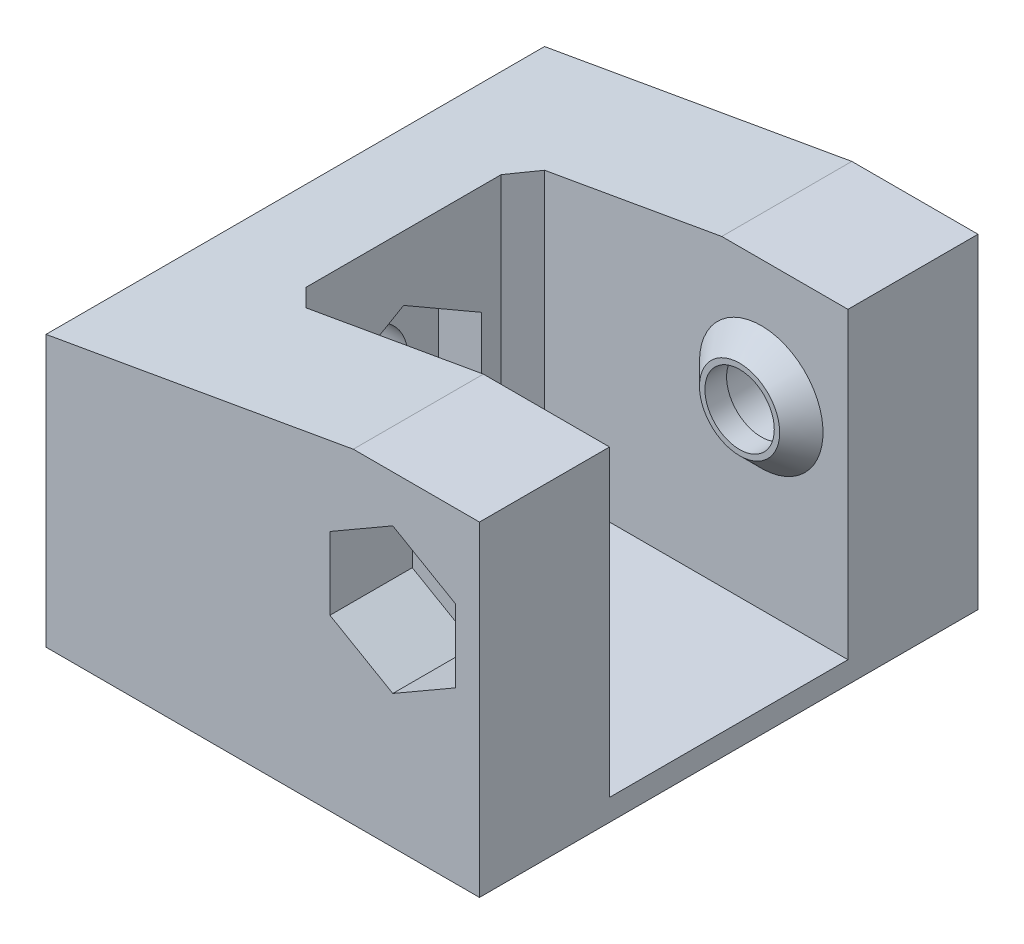
ISO-10303-21;
HEADER;
FILE_DESCRIPTION(('STEP AP214'),'2;1');
FILE_NAME('part.step','',(''),(''),'','','');
FILE_SCHEMA(('AUTOMOTIVE_DESIGN { 1 0 10303 214 1 1 1 1 }'));
ENDSEC;
DATA;
#1=APPLICATION_CONTEXT('core data for automotive mechanical design processes');
#2=APPLICATION_PROTOCOL_DEFINITION('international standard','automotive_design',2000,#1);
#3=PRODUCT_CONTEXT('',#1,'mechanical');
#4=PRODUCT('Part','Part','',(#3));
#5=PRODUCT_RELATED_PRODUCT_CATEGORY('part','',(#4));
#6=PRODUCT_DEFINITION_FORMATION('','',#4);
#7=PRODUCT_DEFINITION_CONTEXT('part definition',#1,'design');
#8=PRODUCT_DEFINITION('design','',#6,#7);
#9=PRODUCT_DEFINITION_SHAPE('','',#8);
#10=(LENGTH_UNIT() NAMED_UNIT(*) SI_UNIT(.MILLI.,.METRE.));
#11=(NAMED_UNIT(*) PLANE_ANGLE_UNIT() SI_UNIT($,.RADIAN.));
#12=(NAMED_UNIT(*) SI_UNIT($,.STERADIAN.) SOLID_ANGLE_UNIT());
#13=UNCERTAINTY_MEASURE_WITH_UNIT(LENGTH_MEASURE(1.E-05),#10,'distance_accuracy_value','');
#14=(GEOMETRIC_REPRESENTATION_CONTEXT(3) GLOBAL_UNCERTAINTY_ASSIGNED_CONTEXT((#13)) GLOBAL_UNIT_ASSIGNED_CONTEXT((#10,
#11,#12)) REPRESENTATION_CONTEXT('',''));
#15=CARTESIAN_POINT('',(0.,0.,0.));
#16=DIRECTION('',(0.,0.,1.));
#17=DIRECTION('',(1.,0.,0.));
#18=AXIS2_PLACEMENT_3D('',#15,#16,#17);
#19=CARTESIAN_POINT('',(16.,9.49999999999999,0.));
#20=DIRECTION('',(0.,0.,-1.));
#21=DIRECTION('',(0.,1.,0.));
#22=AXIS2_PLACEMENT_3D('',#19,#20,#21);
#23=CYLINDRICAL_SURFACE('',#22,1.7);
#24=CARTESIAN_POINT('',(16.,9.49999999999999,-6.));
#25=DIRECTION('',(0.,0.,1.));
#26=DIRECTION('',(0.,-1.,0.));
#27=AXIS2_PLACEMENT_3D('',#24,#25,#26);
#28=CIRCLE('',#27,1.7);
#29=CARTESIAN_POINT('',(16.,7.79999999999999,-6.));
#30=VERTEX_POINT('',#29);
#31=EDGE_CURVE('E226',#30,#30,#28,.T.);
#32=ORIENTED_EDGE('',*,*,#31,.F.);
#33=EDGE_LOOP('',(#32));
#34=FACE_BOUND('',#33,.T.);
#35=CARTESIAN_POINT('',(16.,9.49999999999999,-3.8));
#36=DIRECTION('',(0.,0.,1.));
#37=DIRECTION('',(1.,0.,0.));
#38=AXIS2_PLACEMENT_3D('',#35,#36,#37);
#39=CIRCLE('',#38,1.7);
#40=CARTESIAN_POINT('',(17.7,9.49999999999999,-3.8));
#41=VERTEX_POINT('',#40);
#42=EDGE_CURVE('E291',#41,#41,#39,.F.);
#43=ORIENTED_EDGE('',*,*,#42,.F.);
#44=EDGE_LOOP('',(#43));
#45=FACE_BOUND('',#44,.T.);
#46=ADVANCED_FACE('F37',(#34,#45),#23,.F.);
#47=CARTESIAN_POINT('',(16.,9.5,-17.));
#48=DIRECTION('',(0.,0.,-1.));
#49=DIRECTION('',(-1.,0.,0.));
#50=AXIS2_PLACEMENT_3D('',#47,#48,#49);
#51=CIRCLE('',#50,1.7);
#52=CARTESIAN_POINT('',(14.3,9.5,-17.));
#53=VERTEX_POINT('',#52);
#54=EDGE_CURVE('E221',#53,#53,#51,.T.);
#55=ORIENTED_EDGE('',*,*,#54,.F.);
#56=EDGE_LOOP('',(#55));
#57=FACE_BOUND('',#56,.T.);
#58=CARTESIAN_POINT('',(16.,9.5,-20.5));
#59=DIRECTION('',(0.,0.,-1.));
#60=DIRECTION('',(-1.,0.,0.));
#61=AXIS2_PLACEMENT_3D('',#58,#59,#60);
#62=CIRCLE('',#61,1.7);
#63=CARTESIAN_POINT('',(14.3,9.5,-20.5));
#64=VERTEX_POINT('',#63);
#65=EDGE_CURVE('E286',#64,#64,#62,.F.);
#66=ORIENTED_EDGE('',*,*,#65,.F.);
#67=EDGE_LOOP('',(#66));
#68=FACE_BOUND('',#67,.T.);
#69=ADVANCED_FACE('F456',(#57,#68),#23,.F.);
#70=CARTESIAN_POINT('',(10.,6.24999999999995,-11.5));
#71=DIRECTION('',(-1.,0.,0.));
#72=DIRECTION('',(0.,0.,1.));
#73=AXIS2_PLACEMENT_3D('',#70,#71,#72);
#74=CYLINDRICAL_SURFACE('',#73,2.2);
#75=CARTESIAN_POINT('',(0.,6.24999999999995,-11.5));
#76=DIRECTION('',(-1.,0.,0.));
#77=DIRECTION('',(0.,0.,1.));
#78=AXIS2_PLACEMENT_3D('',#75,#76,#77);
#79=CIRCLE('',#78,2.2);
#80=CARTESIAN_POINT('',(0.,6.24999999999995,-9.3));
#81=VERTEX_POINT('',#80);
#82=EDGE_CURVE('E262',#81,#81,#79,.T.);
#83=ORIENTED_EDGE('',*,*,#82,.T.);
#84=EDGE_LOOP('',(#83));
#85=FACE_BOUND('',#84,.T.);
#86=CARTESIAN_POINT('',(3.,6.24999999999995,-11.5));
#87=DIRECTION('',(1.,0.,0.));
#88=DIRECTION('',(0.,0.,-1.));
#89=AXIS2_PLACEMENT_3D('',#86,#87,#88);
#90=CIRCLE('',#89,2.2);
#91=CARTESIAN_POINT('',(3.,6.24999999999995,-13.7));
#92=VERTEX_POINT('',#91);
#93=EDGE_CURVE('E282',#92,#92,#90,.F.);
#94=ORIENTED_EDGE('',*,*,#93,.F.);
#95=EDGE_LOOP('',(#94));
#96=FACE_BOUND('',#95,.T.);
#97=ADVANCED_FACE('F437',(#85,#96),#74,.F.);
#98=CARTESIAN_POINT('',(20.,15.,0.));
#99=DIRECTION('',(0.,-1.,0.));
#100=DIRECTION('',(0.,0.,-1.));
#101=AXIS2_PLACEMENT_3D('',#98,#99,#100);
#102=PLANE('',#101);
#103=DIRECTION('',(-1.,0.,0.));
#104=VECTOR('',#103,1.);
#105=CARTESIAN_POINT('',(20.,15.,-23.));
#106=LINE('',#105,#104);
#107=CARTESIAN_POINT('',(20.,15.,-23.));
#108=VERTEX_POINT('',#107);
#109=CARTESIAN_POINT('',(14.1782045490451,15.,-23.));
#110=VERTEX_POINT('',#109);
#111=EDGE_CURVE('E250',#108,#110,#106,.T.);
#112=ORIENTED_EDGE('',*,*,#111,.T.);
#113=DIRECTION('',(0.,0.,1.));
#114=VECTOR('',#113,1.);
#115=CARTESIAN_POINT('',(14.1782045490451,15.,0.));
#116=LINE('',#115,#114);
#117=CARTESIAN_POINT('',(14.1782045490451,15.,-17.));
#118=VERTEX_POINT('',#117);
#119=EDGE_CURVE('E264',#110,#118,#116,.T.);
#120=ORIENTED_EDGE('',*,*,#119,.T.);
#121=DIRECTION('',(1.,0.,0.));
#122=VECTOR('',#121,1.);
#123=CARTESIAN_POINT('',(-18.6010752377383,15.,-17.));
#124=LINE('',#123,#122);
#125=CARTESIAN_POINT('',(20.,15.,-17.));
#126=VERTEX_POINT('',#125);
#127=EDGE_CURVE('E223',#118,#126,#124,.T.);
#128=ORIENTED_EDGE('',*,*,#127,.T.);
#129=DIRECTION('',(0.,0.,1.));
#130=VECTOR('',#129,1.);
#131=CARTESIAN_POINT('',(20.,15.,0.));
#132=LINE('',#131,#130);
#133=EDGE_CURVE('E241',#108,#126,#132,.T.);
#134=ORIENTED_EDGE('',*,*,#133,.F.);
#135=EDGE_LOOP('',(#112,#120,#128,#134));
#136=FACE_BOUND('',#135,.T.);
#137=ADVANCED_FACE('F764',(#136),#102,.F.);
#138=CARTESIAN_POINT('',(20.,0.,0.));
#139=DIRECTION('',(0.,0.,-1.));
#140=DIRECTION('',(0.,1.,0.));
#141=AXIS2_PLACEMENT_3D('',#138,#139,#140);
#142=PLANE('',#141);
#143=DIRECTION('',(0.,-1.,0.));
#144=VECTOR('',#143,1.);
#145=CARTESIAN_POINT('',(13.1,11.1743157806499,0.));
#146=LINE('',#145,#144);
#147=CARTESIAN_POINT('',(13.1,11.1743157806499,0.));
#148=VERTEX_POINT('',#147);
#149=CARTESIAN_POINT('',(13.1,7.82568421935008,0.));
#150=VERTEX_POINT('',#149);
#151=EDGE_CURVE('E359',#148,#150,#146,.T.);
#152=ORIENTED_EDGE('',*,*,#151,.F.);
#153=DIRECTION('',(-0.866025403784438,-0.5,0.));
#154=VECTOR('',#153,1.);
#155=CARTESIAN_POINT('',(16.,12.8486315612998,0.));
#156=LINE('',#155,#154);
#157=CARTESIAN_POINT('',(16.,12.8486315612998,0.));
#158=VERTEX_POINT('',#157);
#159=EDGE_CURVE('E337',#158,#148,#156,.T.);
#160=ORIENTED_EDGE('',*,*,#159,.F.);
#161=DIRECTION('',(-0.866025403784438,0.5,0.));
#162=VECTOR('',#161,1.);
#163=CARTESIAN_POINT('',(18.9,11.1743157806499,0.));
#164=LINE('',#163,#162);
#165=CARTESIAN_POINT('',(18.9,11.1743157806499,0.));
#166=VERTEX_POINT('',#165);
#167=EDGE_CURVE('E342',#166,#158,#164,.T.);
#168=ORIENTED_EDGE('',*,*,#167,.F.);
#169=DIRECTION('',(0.,1.,0.));
#170=VECTOR('',#169,1.);
#171=CARTESIAN_POINT('',(18.9,7.82568421935008,0.));
#172=LINE('',#171,#170);
#173=CARTESIAN_POINT('',(18.9,7.82568421935008,0.));
#174=VERTEX_POINT('',#173);
#175=EDGE_CURVE('E368',#174,#166,#172,.T.);
#176=ORIENTED_EDGE('',*,*,#175,.F.);
#177=DIRECTION('',(0.866025403784438,0.5,0.));
#178=VECTOR('',#177,1.);
#179=CARTESIAN_POINT('',(16.,6.15136843870016,0.));
#180=LINE('',#179,#178);
#181=CARTESIAN_POINT('',(16.,6.15136843870016,0.));
#182=VERTEX_POINT('',#181);
#183=EDGE_CURVE('E365',#182,#174,#180,.T.);
#184=ORIENTED_EDGE('',*,*,#183,.F.);
#185=DIRECTION('',(0.866025403784438,-0.5,0.));
#186=VECTOR('',#185,1.);
#187=CARTESIAN_POINT('',(13.1,7.82568421935008,0.));
#188=LINE('',#187,#186);
#189=EDGE_CURVE('E362',#150,#182,#188,.T.);
#190=ORIENTED_EDGE('',*,*,#189,.F.);
#191=EDGE_LOOP('',(#152,#160,#168,#176,#184,#190));
#192=FACE_BOUND('',#191,.T.);
#193=DIRECTION('',(0.,-1.,0.));
#194=VECTOR('',#193,1.);
#195=CARTESIAN_POINT('',(0.,0.,0.));
#196=LINE('',#195,#194);
#197=CARTESIAN_POINT('',(0.,12.4999999999999,0.));
#198=VERTEX_POINT('',#197);
#199=CARTESIAN_POINT('',(0.,0.,0.));
#200=VERTEX_POINT('',#199);
#201=EDGE_CURVE('E230',#198,#200,#196,.T.);
#202=ORIENTED_EDGE('',*,*,#201,.T.);
#203=DIRECTION('',(-1.,0.,0.));
#204=VECTOR('',#203,1.);
#205=CARTESIAN_POINT('',(20.,0.,0.));
#206=LINE('',#205,#204);
#207=CARTESIAN_POINT('',(20.,0.,0.));
#208=VERTEX_POINT('',#207);
#209=EDGE_CURVE('E256',#208,#200,#206,.T.);
#210=ORIENTED_EDGE('',*,*,#209,.F.);
#211=DIRECTION('',(0.,-1.,0.));
#212=VECTOR('',#211,1.);
#213=CARTESIAN_POINT('',(20.,0.,0.));
#214=LINE('',#213,#212);
#215=CARTESIAN_POINT('',(20.,15.,0.));
#216=VERTEX_POINT('',#215);
#217=EDGE_CURVE('E233',#216,#208,#214,.T.);
#218=ORIENTED_EDGE('',*,*,#217,.F.);
#219=DIRECTION('',(-1.,0.,0.));
#220=VECTOR('',#219,1.);
#221=CARTESIAN_POINT('',(20.,15.,0.));
#222=LINE('',#221,#220);
#223=CARTESIAN_POINT('',(14.1782045490451,15.,0.));
#224=VERTEX_POINT('',#223);
#225=EDGE_CURVE('E243',#216,#224,#222,.T.);
#226=ORIENTED_EDGE('',*,*,#225,.T.);
#227=DIRECTION('',(-0.984807753012209,-0.173648177666927,0.));
#228=VECTOR('',#227,1.);
#229=CARTESIAN_POINT('',(14.1782045490451,15.,0.));
#230=LINE('',#229,#228);
#231=EDGE_CURVE('E274',#224,#198,#230,.T.);
#232=ORIENTED_EDGE('',*,*,#231,.T.);
#233=EDGE_LOOP('',(#202,#210,#218,#226,#232));
#234=FACE_BOUND('',#233,.T.);
#235=ADVANCED_FACE('F521',(#192,#234),#142,.F.);
#236=CARTESIAN_POINT('',(20.,0.,0.));
#237=DIRECTION('',(0.,1.,0.));
#238=DIRECTION('',(0.,0.,1.));
#239=AXIS2_PLACEMENT_3D('',#236,#237,#238);
#240=PLANE('',#239);
#241=DIRECTION('',(-1.,0.,0.));
#242=VECTOR('',#241,1.);
#243=CARTESIAN_POINT('',(20.,0.,-23.));
#244=LINE('',#243,#242);
#245=CARTESIAN_POINT('',(20.,0.,-23.));
#246=VERTEX_POINT('',#245);
#247=CARTESIAN_POINT('',(0.,0.,-23.));
#248=VERTEX_POINT('',#247);
#249=EDGE_CURVE('E253',#246,#248,#244,.T.);
#250=ORIENTED_EDGE('',*,*,#249,.F.);
#251=DIRECTION('',(0.,0.,-1.));
#252=VECTOR('',#251,1.);
#253=CARTESIAN_POINT('',(20.,0.,0.));
#254=LINE('',#253,#252);
#255=EDGE_CURVE('E235',#208,#246,#254,.T.);
#256=ORIENTED_EDGE('',*,*,#255,.F.);
#257=ORIENTED_EDGE('',*,*,#209,.T.);
#258=DIRECTION('',(0.,0.,-1.));
#259=VECTOR('',#258,1.);
#260=CARTESIAN_POINT('',(0.,0.,0.));
#261=LINE('',#260,#259);
#262=EDGE_CURVE('E245',#200,#248,#261,.T.);
#263=ORIENTED_EDGE('',*,*,#262,.T.);
#264=EDGE_LOOP('',(#250,#256,#257,#263));
#265=FACE_BOUND('',#264,.T.);
#266=ADVANCED_FACE('F517',(#265),#240,.F.);
#267=CARTESIAN_POINT('',(20.,0.,-23.));
#268=DIRECTION('',(0.,0.,1.));
#269=DIRECTION('',(0.,-1.,0.));
#270=AXIS2_PLACEMENT_3D('',#267,#268,#269);
#271=PLANE('',#270);
#272=CARTESIAN_POINT('',(16.,9.5,-23.));
#273=DIRECTION('',(0.,0.,-1.));
#274=DIRECTION('',(-1.,0.,0.));
#275=AXIS2_PLACEMENT_3D('',#272,#273,#274);
#276=CIRCLE('',#275,3.25);
#277=CARTESIAN_POINT('',(12.75,9.5,-23.));
#278=VERTEX_POINT('',#277);
#279=EDGE_CURVE('E294',#278,#278,#276,.T.);
#280=ORIENTED_EDGE('',*,*,#279,.F.);
#281=EDGE_LOOP('',(#280));
#282=FACE_BOUND('',#281,.T.);
#283=ORIENTED_EDGE('',*,*,#111,.F.);
#284=DIRECTION('',(0.,1.,0.));
#285=VECTOR('',#284,1.);
#286=CARTESIAN_POINT('',(20.,0.,-23.));
#287=LINE('',#286,#285);
#288=EDGE_CURVE('E238',#246,#108,#287,.T.);
#289=ORIENTED_EDGE('',*,*,#288,.F.);
#290=ORIENTED_EDGE('',*,*,#249,.T.);
#291=DIRECTION('',(0.,1.,0.));
#292=VECTOR('',#291,1.);
#293=CARTESIAN_POINT('',(0.,0.,-23.));
#294=LINE('',#293,#292);
#295=CARTESIAN_POINT('',(0.,12.4999999999999,-23.));
#296=VERTEX_POINT('',#295);
#297=EDGE_CURVE('E236',#248,#296,#294,.T.);
#298=ORIENTED_EDGE('',*,*,#297,.T.);
#299=DIRECTION('',(0.984807753012209,0.173648177666927,0.));
#300=VECTOR('',#299,1.);
#301=CARTESIAN_POINT('',(14.1782045490451,15.,-23.));
#302=LINE('',#301,#300);
#303=EDGE_CURVE('E279',#296,#110,#302,.T.);
#304=ORIENTED_EDGE('',*,*,#303,.T.);
#305=EDGE_LOOP('',(#283,#289,#290,#298,#304));
#306=FACE_BOUND('',#305,.T.);
#307=ADVANCED_FACE('F520',(#282,#306),#271,.F.);
#308=DIRECTION('',(1.,0.,0.));
#309=VECTOR('',#308,1.);
#310=CARTESIAN_POINT('',(-18.6010752377383,15.,-6.));
#311=LINE('',#310,#309);
#312=CARTESIAN_POINT('',(14.1782045490451,15.,-6.));
#313=VERTEX_POINT('',#312);
#314=CARTESIAN_POINT('',(20.,15.,-6.));
#315=VERTEX_POINT('',#314);
#316=EDGE_CURVE('E220',#313,#315,#311,.T.);
#317=ORIENTED_EDGE('',*,*,#316,.F.);
#318=DIRECTION('',(0.,0.,1.));
#319=VECTOR('',#318,1.);
#320=CARTESIAN_POINT('',(14.1782045490451,15.,0.));
#321=LINE('',#320,#319);
#322=EDGE_CURVE('E259',#313,#224,#321,.T.);
#323=ORIENTED_EDGE('',*,*,#322,.T.);
#324=ORIENTED_EDGE('',*,*,#225,.F.);
#325=EDGE_CURVE('E240',#315,#216,#132,.T.);
#326=ORIENTED_EDGE('',*,*,#325,.F.);
#327=EDGE_LOOP('',(#317,#323,#324,#326));
#328=FACE_BOUND('',#327,.T.);
#329=ADVANCED_FACE('F452',(#328),#102,.F.);
#330=CARTESIAN_POINT('',(20.,0.,0.));
#331=DIRECTION('',(-1.,0.,0.));
#332=DIRECTION('',(0.,0.,1.));
#333=AXIS2_PLACEMENT_3D('',#330,#331,#332);
#334=PLANE('',#333);
#335=ORIENTED_EDGE('',*,*,#217,.T.);
#336=ORIENTED_EDGE('',*,*,#255,.T.);
#337=ORIENTED_EDGE('',*,*,#288,.T.);
#338=ORIENTED_EDGE('',*,*,#133,.T.);
#339=DIRECTION('',(0.,1.,0.));
#340=VECTOR('',#339,1.);
#341=CARTESIAN_POINT('',(20.,15.,-17.));
#342=LINE('',#341,#340);
#343=CARTESIAN_POINT('',(20.,1.,-17.));
#344=VERTEX_POINT('',#343);
#345=EDGE_CURVE('E215',#344,#126,#342,.T.);
#346=ORIENTED_EDGE('',*,*,#345,.F.);
#347=DIRECTION('',(0.,0.,-1.));
#348=VECTOR('',#347,1.);
#349=CARTESIAN_POINT('',(20.,0.999999999999995,20.0249843945008));
#350=LINE('',#349,#348);
#351=CARTESIAN_POINT('',(20.,1.,-6.));
#352=VERTEX_POINT('',#351);
#353=EDGE_CURVE('E201',#352,#344,#350,.T.);
#354=ORIENTED_EDGE('',*,*,#353,.F.);
#355=DIRECTION('',(0.,-1.,0.));
#356=VECTOR('',#355,1.);
#357=CARTESIAN_POINT('',(20.,15.,-6.));
#358=LINE('',#357,#356);
#359=EDGE_CURVE('E212',#315,#352,#358,.T.);
#360=ORIENTED_EDGE('',*,*,#359,.F.);
#361=ORIENTED_EDGE('',*,*,#325,.T.);
#362=EDGE_LOOP('',(#335,#336,#337,#338,#346,#354,#360,#361));
#363=FACE_BOUND('',#362,.T.);
#364=ADVANCED_FACE('F211',(#363),#334,.F.);
#365=CARTESIAN_POINT('',(0.,0.,0.));
#366=DIRECTION('',(-1.,0.,0.));
#367=DIRECTION('',(0.,0.,1.));
#368=AXIS2_PLACEMENT_3D('',#365,#366,#367);
#369=PLANE('',#368);
#370=DIRECTION('',(0.,0.,-1.));
#371=VECTOR('',#370,1.);
#372=CARTESIAN_POINT('',(0.,12.4999999999999,-23.));
#373=LINE('',#372,#371);
#374=EDGE_CURVE('E276',#198,#296,#373,.T.);
#375=ORIENTED_EDGE('',*,*,#374,.T.);
#376=ORIENTED_EDGE('',*,*,#297,.F.);
#377=ORIENTED_EDGE('',*,*,#262,.F.);
#378=ORIENTED_EDGE('',*,*,#201,.F.);
#379=EDGE_LOOP('',(#375,#376,#377,#378));
#380=FACE_BOUND('',#379,.T.);
#381=ORIENTED_EDGE('',*,*,#82,.F.);
#382=EDGE_LOOP('',(#381));
#383=FACE_BOUND('',#382,.T.);
#384=ADVANCED_FACE('F440',(#380,#383),#369,.T.);
#385=CARTESIAN_POINT('',(5.,0.,0.));
#386=DIRECTION('',(-1.,0.,0.));
#387=DIRECTION('',(0.,0.,1.));
#388=AXIS2_PLACEMENT_3D('',#385,#386,#387);
#389=PLANE('',#388);
#390=DIRECTION('',(0.,-1.,0.));
#391=VECTOR('',#390,1.);
#392=CARTESIAN_POINT('',(5.,8.3284609690826,-7.9));
#393=LINE('',#392,#391);
#394=CARTESIAN_POINT('',(5.,8.3284609690826,-7.9));
#395=VERTEX_POINT('',#394);
#396=CARTESIAN_POINT('',(5.,4.1715390309173,-7.9));
#397=VERTEX_POINT('',#396);
#398=EDGE_CURVE('E409',#395,#397,#393,.T.);
#399=ORIENTED_EDGE('',*,*,#398,.F.);
#400=DIRECTION('',(0.,-0.5,0.866025403784439));
#401=VECTOR('',#400,1.);
#402=CARTESIAN_POINT('',(5.,10.4069219381653,-11.5));
#403=LINE('',#402,#401);
#404=CARTESIAN_POINT('',(5.,10.4069219381653,-11.5));
#405=VERTEX_POINT('',#404);
#406=EDGE_CURVE('E289',#405,#395,#403,.T.);
#407=ORIENTED_EDGE('',*,*,#406,.F.);
#408=DIRECTION('',(0.,0.5,0.866025403784438));
#409=VECTOR('',#408,1.);
#410=CARTESIAN_POINT('',(5.,8.32846096908261,-15.1));
#411=LINE('',#410,#409);
#412=CARTESIAN_POINT('',(5.,8.32846096908261,-15.1));
#413=VERTEX_POINT('',#412);
#414=EDGE_CURVE('E392',#413,#405,#411,.T.);
#415=ORIENTED_EDGE('',*,*,#414,.F.);
#416=DIRECTION('',(0.,1.,0.));
#417=VECTOR('',#416,1.);
#418=CARTESIAN_POINT('',(5.,4.1715390309173,-15.1));
#419=LINE('',#418,#417);
#420=CARTESIAN_POINT('',(5.,4.1715390309173,-15.1));
#421=VERTEX_POINT('',#420);
#422=EDGE_CURVE('E418',#421,#413,#419,.T.);
#423=ORIENTED_EDGE('',*,*,#422,.F.);
#424=DIRECTION('',(0.,0.5,-0.866025403784438));
#425=VECTOR('',#424,1.);
#426=CARTESIAN_POINT('',(5.,2.09307806183464,-11.5));
#427=LINE('',#426,#425);
#428=CARTESIAN_POINT('',(5.,2.09307806183464,-11.5));
#429=VERTEX_POINT('',#428);
#430=EDGE_CURVE('E415',#429,#421,#427,.T.);
#431=ORIENTED_EDGE('',*,*,#430,.F.);
#432=DIRECTION('',(0.,-0.5,-0.866025403784438));
#433=VECTOR('',#432,1.);
#434=CARTESIAN_POINT('',(5.,4.1715390309173,-7.9));
#435=LINE('',#434,#433);
#436=EDGE_CURVE('E412',#397,#429,#435,.T.);
#437=ORIENTED_EDGE('',*,*,#436,.F.);
#438=EDGE_LOOP('',(#399,#407,#415,#423,#431,#437));
#439=FACE_BOUND('',#438,.T.);
#440=DIRECTION('',(0.,-1.,0.));
#441=VECTOR('',#440,1.);
#442=CARTESIAN_POINT('',(5.,0.,-7.00000000000001));
#443=LINE('',#442,#441);
#444=CARTESIAN_POINT('',(5.,13.3816349035422,-7.00000000000001));
#445=VERTEX_POINT('',#444);
#446=CARTESIAN_POINT('',(5.,1.,-7.00000000000001));
#447=VERTEX_POINT('',#446);
#448=EDGE_CURVE('E297',#445,#447,#443,.T.);
#449=ORIENTED_EDGE('',*,*,#448,.T.);
#450=DIRECTION('',(0.,0.,-1.));
#451=VECTOR('',#450,1.);
#452=CARTESIAN_POINT('',(5.,1.,0.));
#453=LINE('',#452,#451);
#454=CARTESIAN_POINT('',(5.,1.,-16.));
#455=VERTEX_POINT('',#454);
#456=EDGE_CURVE('E852',#447,#455,#453,.T.);
#457=ORIENTED_EDGE('',*,*,#456,.T.);
#458=DIRECTION('',(0.,1.,0.));
#459=VECTOR('',#458,1.);
#460=CARTESIAN_POINT('',(5.,13.3816349035422,-16.));
#461=LINE('',#460,#459);
#462=CARTESIAN_POINT('',(5.,13.3816349035422,-16.));
#463=VERTEX_POINT('',#462);
#464=EDGE_CURVE('E281',#455,#463,#461,.T.);
#465=ORIENTED_EDGE('',*,*,#464,.T.);
#466=DIRECTION('',(0.,0.,1.));
#467=VECTOR('',#466,1.);
#468=CARTESIAN_POINT('',(5.,13.3816349035422,0.));
#469=LINE('',#468,#467);
#470=EDGE_CURVE('E269',#463,#445,#469,.T.);
#471=ORIENTED_EDGE('',*,*,#470,.T.);
#472=EDGE_LOOP('',(#449,#457,#465,#471));
#473=FACE_BOUND('',#472,.T.);
#474=ADVANCED_FACE('F442',(#439,#473),#389,.F.);
#475=CARTESIAN_POINT('',(-18.6010752377383,15.,-17.));
#476=DIRECTION('',(0.,0.,-1.));
#477=DIRECTION('',(-1.,0.,0.));
#478=AXIS2_PLACEMENT_3D('',#475,#476,#477);
#479=PLANE('',#478);
#480=CARTESIAN_POINT('',(16.,9.5,-17.));
#481=DIRECTION('',(0.,0.,-1.));
#482=DIRECTION('',(-1.,0.,0.));
#483=AXIS2_PLACEMENT_3D('',#480,#481,#482);
#484=CIRCLE('',#483,2.84999999999999);
#485=CARTESIAN_POINT('',(13.15,9.5,-17.));
#486=VERTEX_POINT('',#485);
#487=EDGE_CURVE('E45',#486,#486,#484,.T.);
#488=ORIENTED_EDGE('',*,*,#487,.T.);
#489=EDGE_LOOP('',(#488));
#490=FACE_BOUND('',#489,.T.);
#491=DIRECTION('',(0.,-1.,0.));
#492=VECTOR('',#491,1.);
#493=CARTESIAN_POINT('',(5.99999999999999,0.,-17.));
#494=LINE('',#493,#492);
#495=CARTESIAN_POINT('',(5.99999999999999,13.5579618842507,-17.));
#496=VERTEX_POINT('',#495);
#497=CARTESIAN_POINT('',(5.99999999999999,1.,-17.));
#498=VERTEX_POINT('',#497);
#499=EDGE_CURVE('E301',#496,#498,#494,.T.);
#500=ORIENTED_EDGE('',*,*,#499,.T.);
#501=DIRECTION('',(1.,0.,0.));
#502=VECTOR('',#501,1.);
#503=CARTESIAN_POINT('',(-18.6010752377383,1.,-17.));
#504=LINE('',#503,#502);
#505=EDGE_CURVE('E216',#498,#344,#504,.T.);
#506=ORIENTED_EDGE('',*,*,#505,.T.);
#507=ORIENTED_EDGE('',*,*,#345,.T.);
#508=ORIENTED_EDGE('',*,*,#127,.F.);
#509=DIRECTION('',(-0.984807753012209,-0.173648177666927,0.));
#510=VECTOR('',#509,1.);
#511=CARTESIAN_POINT('',(14.1782045490451,15.,-17.));
#512=LINE('',#511,#510);
#513=EDGE_CURVE('E267',#118,#496,#512,.T.);
#514=ORIENTED_EDGE('',*,*,#513,.T.);
#515=EDGE_LOOP('',(#500,#506,#507,#508,#514));
#516=FACE_BOUND('',#515,.T.);
#517=ADVANCED_FACE('F312',(#490,#516),#479,.F.);
#518=CARTESIAN_POINT('',(-18.6010752377383,15.,-6.));
#519=DIRECTION('',(0.,0.,1.));
#520=DIRECTION('',(0.,-1.,0.));
#521=AXIS2_PLACEMENT_3D('',#518,#519,#520);
#522=PLANE('',#521);
#523=CARTESIAN_POINT('',(16.,9.49999999999999,-6.));
#524=DIRECTION('',(0.,0.,1.));
#525=DIRECTION('',(0.,-1.,0.));
#526=AXIS2_PLACEMENT_3D('',#523,#524,#525);
#527=CIRCLE('',#526,2.85);
#528=CARTESIAN_POINT('',(16.,6.64999999999999,-6.));
#529=VERTEX_POINT('',#528);
#530=EDGE_CURVE('E307',#529,#529,#527,.T.);
#531=ORIENTED_EDGE('',*,*,#530,.T.);
#532=EDGE_LOOP('',(#531));
#533=FACE_BOUND('',#532,.T.);
#534=ORIENTED_EDGE('',*,*,#359,.T.);
#535=DIRECTION('',(-1.,0.,0.));
#536=VECTOR('',#535,1.);
#537=CARTESIAN_POINT('',(-18.6010752377383,1.,-6.));
#538=LINE('',#537,#536);
#539=CARTESIAN_POINT('',(6.,1.,-6.));
#540=VERTEX_POINT('',#539);
#541=EDGE_CURVE('E198',#352,#540,#538,.T.);
#542=ORIENTED_EDGE('',*,*,#541,.T.);
#543=DIRECTION('',(0.,1.,0.));
#544=VECTOR('',#543,1.);
#545=CARTESIAN_POINT('',(6.,13.3816349035422,-6.));
#546=LINE('',#545,#544);
#547=CARTESIAN_POINT('',(6.,13.5579618842507,-6.));
#548=VERTEX_POINT('',#547);
#549=EDGE_CURVE('E60',#540,#548,#546,.T.);
#550=ORIENTED_EDGE('',*,*,#549,.T.);
#551=DIRECTION('',(0.984807753012209,0.173648177666927,0.));
#552=VECTOR('',#551,1.);
#553=CARTESIAN_POINT('',(14.1782045490451,15.,-6.));
#554=LINE('',#553,#552);
#555=EDGE_CURVE('E272',#548,#313,#554,.T.);
#556=ORIENTED_EDGE('',*,*,#555,.T.);
#557=ORIENTED_EDGE('',*,*,#316,.T.);
#558=EDGE_LOOP('',(#534,#542,#550,#556,#557));
#559=FACE_BOUND('',#558,.T.);
#560=ADVANCED_FACE('F218',(#533,#559),#522,.F.);
#561=CARTESIAN_POINT('',(14.1782045490451,15.,0.));
#562=DIRECTION('',(-0.173648177666927,0.984807753012209,0.));
#563=DIRECTION('',(0.,0.,-1.));
#564=AXIS2_PLACEMENT_3D('',#561,#562,#563);
#565=PLANE('',#564);
#566=ORIENTED_EDGE('',*,*,#303,.F.);
#567=ORIENTED_EDGE('',*,*,#374,.F.);
#568=ORIENTED_EDGE('',*,*,#231,.F.);
#569=ORIENTED_EDGE('',*,*,#322,.F.);
#570=ORIENTED_EDGE('',*,*,#555,.F.);
#571=DIRECTION('',(0.70167384315986,0.123724030206481,0.701673843159867));
#572=VECTOR('',#571,1.);
#573=CARTESIAN_POINT('',(3.83828787466974,13.1767937120303,-8.16171212533029));
#574=LINE('',#573,#572);
#575=EDGE_CURVE('E304',#548,#445,#574,.F.);
#576=ORIENTED_EDGE('',*,*,#575,.T.);
#577=ORIENTED_EDGE('',*,*,#470,.F.);
#578=DIRECTION('',(-0.701673843159859,-0.123724030206481,0.701673843159868));
#579=VECTOR('',#578,1.);
#580=CARTESIAN_POINT('',(3.83828787466974,13.1767937120303,-14.8382878746697));
#581=LINE('',#580,#579);
#582=EDGE_CURVE('E52',#463,#496,#581,.F.);
#583=ORIENTED_EDGE('',*,*,#582,.T.);
#584=ORIENTED_EDGE('',*,*,#513,.F.);
#585=ORIENTED_EDGE('',*,*,#119,.F.);
#586=EDGE_LOOP('',(#566,#567,#568,#569,#570,#576,#577,#583,#584,#585));
#587=FACE_BOUND('',#586,.T.);
#588=ADVANCED_FACE('F470',(#587),#565,.T.);
#589=CARTESIAN_POINT('',(3.,0.,0.));
#590=DIRECTION('',(1.,0.,0.));
#591=DIRECTION('',(0.,0.,-1.));
#592=AXIS2_PLACEMENT_3D('',#589,#590,#591);
#593=PLANE('',#592);
#594=DIRECTION('',(0.,-0.5,0.866025403784439));
#595=VECTOR('',#594,1.);
#596=CARTESIAN_POINT('',(3.,10.4069219381653,-11.5));
#597=LINE('',#596,#595);
#598=CARTESIAN_POINT('',(3.,10.4069219381653,-11.5));
#599=VERTEX_POINT('',#598);
#600=CARTESIAN_POINT('',(3.,8.3284609690826,-7.9));
#601=VERTEX_POINT('',#600);
#602=EDGE_CURVE('E388',#599,#601,#597,.T.);
#603=ORIENTED_EDGE('',*,*,#602,.T.);
#604=DIRECTION('',(0.,-1.,0.));
#605=VECTOR('',#604,1.);
#606=CARTESIAN_POINT('',(3.,8.3284609690826,-7.9));
#607=LINE('',#606,#605);
#608=CARTESIAN_POINT('',(3.,4.1715390309173,-7.9));
#609=VERTEX_POINT('',#608);
#610=EDGE_CURVE('E391',#601,#609,#607,.T.);
#611=ORIENTED_EDGE('',*,*,#610,.T.);
#612=DIRECTION('',(0.,-0.5,-0.866025403784438));
#613=VECTOR('',#612,1.);
#614=CARTESIAN_POINT('',(3.,4.1715390309173,-7.9));
#615=LINE('',#614,#613);
#616=CARTESIAN_POINT('',(3.,2.09307806183464,-11.5));
#617=VERTEX_POINT('',#616);
#618=EDGE_CURVE('E395',#609,#617,#615,.T.);
#619=ORIENTED_EDGE('',*,*,#618,.T.);
#620=DIRECTION('',(0.,0.5,-0.866025403784438));
#621=VECTOR('',#620,1.);
#622=CARTESIAN_POINT('',(3.,2.09307806183464,-11.5));
#623=LINE('',#622,#621);
#624=CARTESIAN_POINT('',(3.,4.1715390309173,-15.1));
#625=VERTEX_POINT('',#624);
#626=EDGE_CURVE('E398',#617,#625,#623,.T.);
#627=ORIENTED_EDGE('',*,*,#626,.T.);
#628=DIRECTION('',(0.,1.,0.));
#629=VECTOR('',#628,1.);
#630=CARTESIAN_POINT('',(3.,4.1715390309173,-15.1));
#631=LINE('',#630,#629);
#632=CARTESIAN_POINT('',(3.,8.32846096908261,-15.1));
#633=VERTEX_POINT('',#632);
#634=EDGE_CURVE('E401',#625,#633,#631,.T.);
#635=ORIENTED_EDGE('',*,*,#634,.T.);
#636=DIRECTION('',(0.,0.5,0.866025403784438));
#637=VECTOR('',#636,1.);
#638=CARTESIAN_POINT('',(3.,8.32846096908261,-15.1));
#639=LINE('',#638,#637);
#640=EDGE_CURVE('E404',#633,#599,#639,.T.);
#641=ORIENTED_EDGE('',*,*,#640,.T.);
#642=EDGE_LOOP('',(#603,#611,#619,#627,#635,#641));
#643=FACE_BOUND('',#642,.T.);
#644=ORIENTED_EDGE('',*,*,#93,.T.);
#645=EDGE_LOOP('',(#644));
#646=FACE_BOUND('',#645,.T.);
#647=ADVANCED_FACE('F588',(#643,#646),#593,.T.);
#648=CARTESIAN_POINT('',(3.,10.4069219381653,-11.5));
#649=DIRECTION('',(0.,0.866025403784439,0.5));
#650=DIRECTION('',(0.,-0.5,0.866025403784439));
#651=AXIS2_PLACEMENT_3D('',#648,#649,#650);
#652=PLANE('',#651);
#653=ORIENTED_EDGE('',*,*,#406,.T.);
#654=DIRECTION('',(1.,0.,0.));
#655=VECTOR('',#654,1.);
#656=CARTESIAN_POINT('',(3.,8.3284609690826,-7.9));
#657=LINE('',#656,#655);
#658=EDGE_CURVE('E407',#601,#395,#657,.T.);
#659=ORIENTED_EDGE('',*,*,#658,.F.);
#660=ORIENTED_EDGE('',*,*,#602,.F.);
#661=DIRECTION('',(1.,0.,0.));
#662=VECTOR('',#661,1.);
#663=CARTESIAN_POINT('',(3.,10.4069219381653,-11.5));
#664=LINE('',#663,#662);
#665=EDGE_CURVE('E285',#599,#405,#664,.T.);
#666=ORIENTED_EDGE('',*,*,#665,.T.);
#667=EDGE_LOOP('',(#653,#659,#660,#666));
#668=FACE_BOUND('',#667,.T.);
#669=ADVANCED_FACE('F740',(#668),#652,.F.);
#670=CARTESIAN_POINT('',(3.,8.32846096908261,-15.1));
#671=DIRECTION('',(0.,0.866025403784439,-0.5));
#672=DIRECTION('',(0.,0.5,0.866025403784439));
#673=AXIS2_PLACEMENT_3D('',#670,#671,#672);
#674=PLANE('',#673);
#675=ORIENTED_EDGE('',*,*,#414,.T.);
#676=ORIENTED_EDGE('',*,*,#665,.F.);
#677=ORIENTED_EDGE('',*,*,#640,.F.);
#678=DIRECTION('',(1.,0.,0.));
#679=VECTOR('',#678,1.);
#680=CARTESIAN_POINT('',(3.,8.32846096908261,-15.1));
#681=LINE('',#680,#679);
#682=EDGE_CURVE('E424',#633,#413,#681,.T.);
#683=ORIENTED_EDGE('',*,*,#682,.T.);
#684=EDGE_LOOP('',(#675,#676,#677,#683));
#685=FACE_BOUND('',#684,.T.);
#686=ADVANCED_FACE('F730',(#685),#674,.F.);
#687=CARTESIAN_POINT('',(3.,4.1715390309173,-15.1));
#688=DIRECTION('',(0.,0.,-1.));
#689=DIRECTION('',(-1.,0.,0.));
#690=AXIS2_PLACEMENT_3D('',#687,#688,#689);
#691=PLANE('',#690);
#692=ORIENTED_EDGE('',*,*,#422,.T.);
#693=ORIENTED_EDGE('',*,*,#682,.F.);
#694=ORIENTED_EDGE('',*,*,#634,.F.);
#695=DIRECTION('',(1.,0.,0.));
#696=VECTOR('',#695,1.);
#697=CARTESIAN_POINT('',(3.,4.1715390309173,-15.1));
#698=LINE('',#697,#696);
#699=EDGE_CURVE('E426',#625,#421,#698,.T.);
#700=ORIENTED_EDGE('',*,*,#699,.T.);
#701=EDGE_LOOP('',(#692,#693,#694,#700));
#702=FACE_BOUND('',#701,.T.);
#703=ADVANCED_FACE('F720',(#702),#691,.F.);
#704=CARTESIAN_POINT('',(3.,2.09307806183464,-11.5));
#705=DIRECTION('',(0.,-0.866025403784439,-0.5));
#706=DIRECTION('',(0.,0.5,-0.866025403784439));
#707=AXIS2_PLACEMENT_3D('',#704,#705,#706);
#708=PLANE('',#707);
#709=ORIENTED_EDGE('',*,*,#430,.T.);
#710=ORIENTED_EDGE('',*,*,#699,.F.);
#711=ORIENTED_EDGE('',*,*,#626,.F.);
#712=DIRECTION('',(1.,0.,0.));
#713=VECTOR('',#712,1.);
#714=CARTESIAN_POINT('',(3.,2.09307806183464,-11.5));
#715=LINE('',#714,#713);
#716=EDGE_CURVE('E428',#617,#429,#715,.T.);
#717=ORIENTED_EDGE('',*,*,#716,.T.);
#718=EDGE_LOOP('',(#709,#710,#711,#717));
#719=FACE_BOUND('',#718,.T.);
#720=ADVANCED_FACE('F710',(#719),#708,.F.);
#721=CARTESIAN_POINT('',(3.,4.1715390309173,-7.9));
#722=DIRECTION('',(0.,-0.866025403784439,0.5));
#723=DIRECTION('',(0.,-0.5,-0.866025403784439));
#724=AXIS2_PLACEMENT_3D('',#721,#722,#723);
#725=PLANE('',#724);
#726=ORIENTED_EDGE('',*,*,#436,.T.);
#727=ORIENTED_EDGE('',*,*,#716,.F.);
#728=ORIENTED_EDGE('',*,*,#618,.F.);
#729=DIRECTION('',(1.,0.,0.));
#730=VECTOR('',#729,1.);
#731=CARTESIAN_POINT('',(3.,4.1715390309173,-7.9));
#732=LINE('',#731,#730);
#733=EDGE_CURVE('E430',#609,#397,#732,.T.);
#734=ORIENTED_EDGE('',*,*,#733,.T.);
#735=EDGE_LOOP('',(#726,#727,#728,#734));
#736=FACE_BOUND('',#735,.T.);
#737=ADVANCED_FACE('F700',(#736),#725,.F.);
#738=CARTESIAN_POINT('',(3.,8.3284609690826,-7.9));
#739=DIRECTION('',(0.,0.,1.));
#740=DIRECTION('',(0.,-1.,0.));
#741=AXIS2_PLACEMENT_3D('',#738,#739,#740);
#742=PLANE('',#741);
#743=ORIENTED_EDGE('',*,*,#398,.T.);
#744=ORIENTED_EDGE('',*,*,#733,.F.);
#745=ORIENTED_EDGE('',*,*,#610,.F.);
#746=ORIENTED_EDGE('',*,*,#658,.T.);
#747=EDGE_LOOP('',(#743,#744,#745,#746));
#748=FACE_BOUND('',#747,.T.);
#749=ADVANCED_FACE('F683',(#748),#742,.F.);
#750=CARTESIAN_POINT('',(16.,9.5,-20.5));
#751=DIRECTION('',(0.,0.,-1.));
#752=DIRECTION('',(-1.,0.,0.));
#753=AXIS2_PLACEMENT_3D('',#750,#751,#752);
#754=PLANE('',#753);
#755=CARTESIAN_POINT('',(16.,9.5,-20.5));
#756=DIRECTION('',(0.,0.,-1.));
#757=DIRECTION('',(-1.,0.,0.));
#758=AXIS2_PLACEMENT_3D('',#755,#756,#757);
#759=CIRCLE('',#758,3.25);
#760=CARTESIAN_POINT('',(12.75,9.5,-20.5));
#761=VERTEX_POINT('',#760);
#762=EDGE_CURVE('E290',#761,#761,#759,.T.);
#763=ORIENTED_EDGE('',*,*,#762,.T.);
#764=EDGE_LOOP('',(#763));
#765=FACE_BOUND('',#764,.T.);
#766=ORIENTED_EDGE('',*,*,#65,.T.);
#767=EDGE_LOOP('',(#766));
#768=FACE_BOUND('',#767,.T.);
#769=ADVANCED_FACE('F673',(#765,#768),#754,.T.);
#770=CARTESIAN_POINT('',(16.,9.5,-20.5));
#771=DIRECTION('',(0.,0.,-1.));
#772=DIRECTION('',(-1.,0.,0.));
#773=AXIS2_PLACEMENT_3D('',#770,#771,#772);
#774=CYLINDRICAL_SURFACE('',#773,3.25);
#775=ORIENTED_EDGE('',*,*,#762,.F.);
#776=EDGE_LOOP('',(#775));
#777=FACE_BOUND('',#776,.T.);
#778=ORIENTED_EDGE('',*,*,#279,.T.);
#779=EDGE_LOOP('',(#778));
#780=FACE_BOUND('',#779,.T.);
#781=ADVANCED_FACE('F658',(#777,#780),#774,.F.);
#782=CARTESIAN_POINT('',(0.,0.,-3.8));
#783=DIRECTION('',(0.,0.,1.));
#784=DIRECTION('',(1.,0.,0.));
#785=AXIS2_PLACEMENT_3D('',#782,#783,#784);
#786=PLANE('',#785);
#787=DIRECTION('',(-0.866025403784438,-0.5,0.));
#788=VECTOR('',#787,1.);
#789=CARTESIAN_POINT('',(16.,12.8486315612998,-3.8));
#790=LINE('',#789,#788);
#791=CARTESIAN_POINT('',(16.,12.8486315612998,-3.8));
#792=VERTEX_POINT('',#791);
#793=CARTESIAN_POINT('',(13.1,11.1743157806499,-3.8));
#794=VERTEX_POINT('',#793);
#795=EDGE_CURVE('E338',#792,#794,#790,.T.);
#796=ORIENTED_EDGE('',*,*,#795,.T.);
#797=DIRECTION('',(0.,-1.,0.));
#798=VECTOR('',#797,1.);
#799=CARTESIAN_POINT('',(13.1,11.1743157806499,-3.8));
#800=LINE('',#799,#798);
#801=CARTESIAN_POINT('',(13.1,7.82568421935008,-3.8));
#802=VERTEX_POINT('',#801);
#803=EDGE_CURVE('E341',#794,#802,#800,.T.);
#804=ORIENTED_EDGE('',*,*,#803,.T.);
#805=DIRECTION('',(0.866025403784438,-0.5,0.));
#806=VECTOR('',#805,1.);
#807=CARTESIAN_POINT('',(13.1,7.82568421935008,-3.8));
#808=LINE('',#807,#806);
#809=CARTESIAN_POINT('',(16.,6.15136843870016,-3.8));
#810=VERTEX_POINT('',#809);
#811=EDGE_CURVE('E345',#802,#810,#808,.T.);
#812=ORIENTED_EDGE('',*,*,#811,.T.);
#813=DIRECTION('',(0.866025403784438,0.5,0.));
#814=VECTOR('',#813,1.);
#815=CARTESIAN_POINT('',(16.,6.15136843870016,-3.8));
#816=LINE('',#815,#814);
#817=CARTESIAN_POINT('',(18.9,7.82568421935008,-3.8));
#818=VERTEX_POINT('',#817);
#819=EDGE_CURVE('E348',#810,#818,#816,.T.);
#820=ORIENTED_EDGE('',*,*,#819,.T.);
#821=DIRECTION('',(0.,1.,0.));
#822=VECTOR('',#821,1.);
#823=CARTESIAN_POINT('',(18.9,7.82568421935008,-3.8));
#824=LINE('',#823,#822);
#825=CARTESIAN_POINT('',(18.9,11.1743157806499,-3.8));
#826=VERTEX_POINT('',#825);
#827=EDGE_CURVE('E351',#818,#826,#824,.T.);
#828=ORIENTED_EDGE('',*,*,#827,.T.);
#829=DIRECTION('',(-0.866025403784438,0.5,0.));
#830=VECTOR('',#829,1.);
#831=CARTESIAN_POINT('',(18.9,11.1743157806499,-3.8));
#832=LINE('',#831,#830);
#833=EDGE_CURVE('E354',#826,#792,#832,.T.);
#834=ORIENTED_EDGE('',*,*,#833,.T.);
#835=EDGE_LOOP('',(#796,#804,#812,#820,#828,#834));
#836=FACE_BOUND('',#835,.T.);
#837=ORIENTED_EDGE('',*,*,#42,.T.);
#838=EDGE_LOOP('',(#837));
#839=FACE_BOUND('',#838,.T.);
#840=ADVANCED_FACE('F649',(#836,#839),#786,.T.);
#841=CARTESIAN_POINT('',(16.,12.8486315612998,-3.8));
#842=DIRECTION('',(-0.5,0.866025403784438,0.));
#843=DIRECTION('',(-0.866025403784439,-0.5,0.));
#844=AXIS2_PLACEMENT_3D('',#841,#842,#843);
#845=PLANE('',#844);
#846=ORIENTED_EDGE('',*,*,#159,.T.);
#847=DIRECTION('',(0.,0.,1.));
#848=VECTOR('',#847,1.);
#849=CARTESIAN_POINT('',(13.1,11.1743157806499,-3.8));
#850=LINE('',#849,#848);
#851=EDGE_CURVE('E357',#794,#148,#850,.T.);
#852=ORIENTED_EDGE('',*,*,#851,.F.);
#853=ORIENTED_EDGE('',*,*,#795,.F.);
#854=DIRECTION('',(0.,0.,1.));
#855=VECTOR('',#854,1.);
#856=CARTESIAN_POINT('',(16.,12.8486315612998,-3.8));
#857=LINE('',#856,#855);
#858=EDGE_CURVE('E295',#792,#158,#857,.T.);
#859=ORIENTED_EDGE('',*,*,#858,.T.);
#860=EDGE_LOOP('',(#846,#852,#853,#859));
#861=FACE_BOUND('',#860,.T.);
#862=ADVANCED_FACE('F639',(#861),#845,.F.);
#863=CARTESIAN_POINT('',(18.9,11.1743157806499,-3.8));
#864=DIRECTION('',(0.5,0.866025403784438,0.));
#865=DIRECTION('',(-0.866025403784439,0.5,0.));
#866=AXIS2_PLACEMENT_3D('',#863,#864,#865);
#867=PLANE('',#866);
#868=ORIENTED_EDGE('',*,*,#167,.T.);
#869=ORIENTED_EDGE('',*,*,#858,.F.);
#870=ORIENTED_EDGE('',*,*,#833,.F.);
#871=DIRECTION('',(0.,0.,1.));
#872=VECTOR('',#871,1.);
#873=CARTESIAN_POINT('',(18.9,11.1743157806499,-3.8));
#874=LINE('',#873,#872);
#875=EDGE_CURVE('E374',#826,#166,#874,.T.);
#876=ORIENTED_EDGE('',*,*,#875,.T.);
#877=EDGE_LOOP('',(#868,#869,#870,#876));
#878=FACE_BOUND('',#877,.T.);
#879=ADVANCED_FACE('F629',(#878),#867,.F.);
#880=CARTESIAN_POINT('',(18.9,7.82568421935008,-3.8));
#881=DIRECTION('',(1.,0.,0.));
#882=DIRECTION('',(0.,0.,-1.));
#883=AXIS2_PLACEMENT_3D('',#880,#881,#882);
#884=PLANE('',#883);
#885=ORIENTED_EDGE('',*,*,#175,.T.);
#886=ORIENTED_EDGE('',*,*,#875,.F.);
#887=ORIENTED_EDGE('',*,*,#827,.F.);
#888=DIRECTION('',(0.,0.,1.));
#889=VECTOR('',#888,1.);
#890=CARTESIAN_POINT('',(18.9,7.82568421935008,-3.8));
#891=LINE('',#890,#889);
#892=EDGE_CURVE('E376',#818,#174,#891,.T.);
#893=ORIENTED_EDGE('',*,*,#892,.T.);
#894=EDGE_LOOP('',(#885,#886,#887,#893));
#895=FACE_BOUND('',#894,.T.);
#896=ADVANCED_FACE('F619',(#895),#884,.F.);
#897=CARTESIAN_POINT('',(16.,6.15136843870016,-3.8));
#898=DIRECTION('',(0.5,-0.866025403784438,0.));
#899=DIRECTION('',(0.866025403784439,0.5,0.));
#900=AXIS2_PLACEMENT_3D('',#897,#898,#899);
#901=PLANE('',#900);
#902=ORIENTED_EDGE('',*,*,#183,.T.);
#903=ORIENTED_EDGE('',*,*,#892,.F.);
#904=ORIENTED_EDGE('',*,*,#819,.F.);
#905=DIRECTION('',(0.,0.,1.));
#906=VECTOR('',#905,1.);
#907=CARTESIAN_POINT('',(16.,6.15136843870016,-3.8));
#908=LINE('',#907,#906);
#909=EDGE_CURVE('E378',#810,#182,#908,.T.);
#910=ORIENTED_EDGE('',*,*,#909,.T.);
#911=EDGE_LOOP('',(#902,#903,#904,#910));
#912=FACE_BOUND('',#911,.T.);
#913=ADVANCED_FACE('F609',(#912),#901,.F.);
#914=CARTESIAN_POINT('',(13.1,7.82568421935008,-3.8));
#915=DIRECTION('',(-0.5,-0.866025403784438,0.));
#916=DIRECTION('',(0.866025403784439,-0.5,0.));
#917=AXIS2_PLACEMENT_3D('',#914,#915,#916);
#918=PLANE('',#917);
#919=ORIENTED_EDGE('',*,*,#189,.T.);
#920=ORIENTED_EDGE('',*,*,#909,.F.);
#921=ORIENTED_EDGE('',*,*,#811,.F.);
#922=DIRECTION('',(0.,0.,1.));
#923=VECTOR('',#922,1.);
#924=CARTESIAN_POINT('',(13.1,7.82568421935008,-3.8));
#925=LINE('',#924,#923);
#926=EDGE_CURVE('E380',#802,#150,#925,.T.);
#927=ORIENTED_EDGE('',*,*,#926,.T.);
#928=EDGE_LOOP('',(#919,#920,#921,#927));
#929=FACE_BOUND('',#928,.T.);
#930=ADVANCED_FACE('F599',(#929),#918,.F.);
#931=CARTESIAN_POINT('',(13.1,11.1743157806499,-3.8));
#932=DIRECTION('',(-1.,0.,0.));
#933=DIRECTION('',(0.,0.,1.));
#934=AXIS2_PLACEMENT_3D('',#931,#932,#933);
#935=PLANE('',#934);
#936=ORIENTED_EDGE('',*,*,#151,.T.);
#937=ORIENTED_EDGE('',*,*,#926,.F.);
#938=ORIENTED_EDGE('',*,*,#803,.F.);
#939=ORIENTED_EDGE('',*,*,#851,.T.);
#940=EDGE_LOOP('',(#936,#937,#938,#939));
#941=FACE_BOUND('',#940,.T.);
#942=ADVANCED_FACE('F490',(#941),#935,.F.);
#943=CARTESIAN_POINT('',(5.,0.,-7.00000000000001));
#944=DIRECTION('',(0.707106781186551,0.,-0.707106781186544));
#945=DIRECTION('',(0.,1.,0.));
#946=AXIS2_PLACEMENT_3D('',#943,#944,#945);
#947=PLANE('',#946);
#948=ORIENTED_EDGE('',*,*,#549,.F.);
#949=DIRECTION('',(0.707106781186544,0.,0.707106781186551));
#950=VECTOR('',#949,1.);
#951=CARTESIAN_POINT('',(5.,1.,-7.00000000000001));
#952=LINE('',#951,#950);
#953=EDGE_CURVE('E204',#540,#447,#952,.F.);
#954=ORIENTED_EDGE('',*,*,#953,.T.);
#955=ORIENTED_EDGE('',*,*,#448,.F.);
#956=ORIENTED_EDGE('',*,*,#575,.F.);
#957=EDGE_LOOP('',(#948,#954,#955,#956));
#958=FACE_BOUND('',#957,.T.);
#959=ADVANCED_FACE('F485',(#958),#947,.T.);
#960=CARTESIAN_POINT('',(5.,0.,-16.));
#961=DIRECTION('',(0.707106781186552,0.,0.707106781186543));
#962=DIRECTION('',(0.,-1.,0.));
#963=AXIS2_PLACEMENT_3D('',#960,#961,#962);
#964=PLANE('',#963);
#965=ORIENTED_EDGE('',*,*,#464,.F.);
#966=DIRECTION('',(-0.707106781186543,0.,0.707106781186552));
#967=VECTOR('',#966,1.);
#968=CARTESIAN_POINT('',(5.,1.,-16.));
#969=LINE('',#968,#967);
#970=EDGE_CURVE('E12',#455,#498,#969,.F.);
#971=ORIENTED_EDGE('',*,*,#970,.T.);
#972=ORIENTED_EDGE('',*,*,#499,.F.);
#973=ORIENTED_EDGE('',*,*,#582,.F.);
#974=EDGE_LOOP('',(#965,#971,#972,#973));
#975=FACE_BOUND('',#974,.T.);
#976=ADVANCED_FACE('F489',(#975),#964,.T.);
#977=CARTESIAN_POINT('',(16.,9.49999999999999,-6.));
#978=DIRECTION('',(0.,0.,-1.));
#979=DIRECTION('',(0.,1.,0.));
#980=AXIS2_PLACEMENT_3D('',#977,#978,#979);
#981=PLANE('',#980);
#982=CARTESIAN_POINT('',(16.,9.49999999999999,-6.));
#983=DIRECTION('',(0.,0.,-1.));
#984=DIRECTION('',(0.,1.,0.));
#985=AXIS2_PLACEMENT_3D('',#982,#983,#984);
#986=CIRCLE('',#985,1.6);
#987=CARTESIAN_POINT('',(16.,11.1,-6.));
#988=VERTEX_POINT('',#987);
#989=EDGE_CURVE('E322',#988,#988,#986,.T.);
#990=ORIENTED_EDGE('',*,*,#989,.T.);
#991=EDGE_LOOP('',(#990));
#992=FACE_BOUND('',#991,.T.);
#993=ORIENTED_EDGE('',*,*,#31,.T.);
#994=EDGE_LOOP('',(#993));
#995=FACE_BOUND('',#994,.T.);
#996=ADVANCED_FACE('F499',(#992,#995),#981,.F.);
#997=CARTESIAN_POINT('',(16.,9.49999999999999,-7.));
#998=DIRECTION('',(0.,0.,-1.));
#999=DIRECTION('',(0.,1.,0.));
#1000=AXIS2_PLACEMENT_3D('',#997,#998,#999);
#1001=PLANE('',#1000);
#1002=CARTESIAN_POINT('',(16.,9.49999999999999,-7.));
#1003=DIRECTION('',(0.,0.,-1.));
#1004=DIRECTION('',(0.,1.,0.));
#1005=AXIS2_PLACEMENT_3D('',#1002,#1003,#1004);
#1006=CIRCLE('',#1005,1.85);
#1007=CARTESIAN_POINT('',(16.,11.35,-7.));
#1008=VERTEX_POINT('',#1007);
#1009=EDGE_CURVE('E333',#1008,#1008,#1006,.T.);
#1010=ORIENTED_EDGE('',*,*,#1009,.T.);
#1011=EDGE_LOOP('',(#1010));
#1012=FACE_BOUND('',#1011,.T.);
#1013=CARTESIAN_POINT('',(16.,9.49999999999999,-7.));
#1014=DIRECTION('',(0.,0.,-1.));
#1015=DIRECTION('',(0.,1.,0.));
#1016=AXIS2_PLACEMENT_3D('',#1013,#1014,#1015);
#1017=CIRCLE('',#1016,1.6);
#1018=CARTESIAN_POINT('',(16.,11.1,-7.));
#1019=VERTEX_POINT('',#1018);
#1020=EDGE_CURVE('E326',#1019,#1019,#1017,.T.);
#1021=ORIENTED_EDGE('',*,*,#1020,.F.);
#1022=EDGE_LOOP('',(#1021));
#1023=FACE_BOUND('',#1022,.T.);
#1024=ADVANCED_FACE('F565',(#1012,#1023),#1001,.T.);
#1025=CARTESIAN_POINT('',(16.,9.49999999999999,-7.));
#1026=DIRECTION('',(0.,0.,1.));
#1027=DIRECTION('',(0.,-1.,0.));
#1028=AXIS2_PLACEMENT_3D('',#1025,#1026,#1027);
#1029=CYLINDRICAL_SURFACE('',#1028,1.6);
#1030=ORIENTED_EDGE('',*,*,#1020,.T.);
#1031=EDGE_LOOP('',(#1030));
#1032=FACE_BOUND('',#1031,.T.);
#1033=ORIENTED_EDGE('',*,*,#989,.F.);
#1034=EDGE_LOOP('',(#1033));
#1035=FACE_BOUND('',#1034,.T.);
#1036=ADVANCED_FACE('F557',(#1032,#1035),#1029,.F.);
#1037=CARTESIAN_POINT('',(16.,9.5,-17.));
#1038=DIRECTION('',(0.,0.,1.));
#1039=DIRECTION('',(1.,0.,0.));
#1040=AXIS2_PLACEMENT_3D('',#1037,#1038,#1039);
#1041=PLANE('',#1040);
#1042=CARTESIAN_POINT('',(16.,9.5,-17.));
#1043=DIRECTION('',(0.,0.,1.));
#1044=DIRECTION('',(1.,0.,0.));
#1045=AXIS2_PLACEMENT_3D('',#1042,#1043,#1044);
#1046=CIRCLE('',#1045,1.60086457793005);
#1047=CARTESIAN_POINT('',(17.60086457793,9.5,-17.));
#1048=VERTEX_POINT('',#1047);
#1049=EDGE_CURVE('E206',#1048,#1048,#1046,.T.);
#1050=ORIENTED_EDGE('',*,*,#1049,.T.);
#1051=EDGE_LOOP('',(#1050));
#1052=FACE_BOUND('',#1051,.T.);
#1053=ORIENTED_EDGE('',*,*,#54,.T.);
#1054=EDGE_LOOP('',(#1053));
#1055=FACE_BOUND('',#1054,.T.);
#1056=ADVANCED_FACE('F550',(#1052,#1055),#1041,.F.);
#1057=CARTESIAN_POINT('',(16.,9.5,-16.));
#1058=DIRECTION('',(0.,0.,1.));
#1059=DIRECTION('',(1.,0.,0.));
#1060=AXIS2_PLACEMENT_3D('',#1057,#1058,#1059);
#1061=PLANE('',#1060);
#1062=CARTESIAN_POINT('',(16.,9.5,-16.));
#1063=DIRECTION('',(0.,0.,1.));
#1064=DIRECTION('',(1.,0.,0.));
#1065=AXIS2_PLACEMENT_3D('',#1062,#1063,#1064);
#1066=CIRCLE('',#1065,1.85);
#1067=CARTESIAN_POINT('',(17.85,9.5,-16.));
#1068=VERTEX_POINT('',#1067);
#1069=EDGE_CURVE('E320',#1068,#1068,#1066,.T.);
#1070=ORIENTED_EDGE('',*,*,#1069,.T.);
#1071=EDGE_LOOP('',(#1070));
#1072=FACE_BOUND('',#1071,.T.);
#1073=CARTESIAN_POINT('',(16.,9.5,-16.));
#1074=DIRECTION('',(0.,0.,1.));
#1075=DIRECTION('',(1.,0.,0.));
#1076=AXIS2_PLACEMENT_3D('',#1073,#1074,#1075);
#1077=CIRCLE('',#1076,1.60086457793005);
#1078=CARTESIAN_POINT('',(17.60086457793,9.5,-16.));
#1079=VERTEX_POINT('',#1078);
#1080=EDGE_CURVE('E323',#1079,#1079,#1077,.T.);
#1081=ORIENTED_EDGE('',*,*,#1080,.F.);
#1082=EDGE_LOOP('',(#1081));
#1083=FACE_BOUND('',#1082,.T.);
#1084=ADVANCED_FACE('F542',(#1072,#1083),#1061,.T.);
#1085=CARTESIAN_POINT('',(16.,9.5,-16.));
#1086=DIRECTION('',(0.,0.,-1.));
#1087=DIRECTION('',(-1.,0.,0.));
#1088=AXIS2_PLACEMENT_3D('',#1085,#1086,#1087);
#1089=CYLINDRICAL_SURFACE('',#1088,1.60086457793005);
#1090=ORIENTED_EDGE('',*,*,#1080,.T.);
#1091=EDGE_LOOP('',(#1090));
#1092=FACE_BOUND('',#1091,.T.);
#1093=ORIENTED_EDGE('',*,*,#1049,.F.);
#1094=EDGE_LOOP('',(#1093));
#1095=FACE_BOUND('',#1094,.T.);
#1096=ADVANCED_FACE('F535',(#1092,#1095),#1089,.F.);
#1097=CARTESIAN_POINT('',(16.,9.49999999999999,-7.00000000000001));
#1098=DIRECTION('',(0.,0.,1.));
#1099=DIRECTION('',(1.,0.,0.));
#1100=AXIS2_PLACEMENT_3D('',#1097,#1098,#1099);
#1101=CONICAL_SURFACE('',#1100,1.85,0.785398163397444);
#1102=ORIENTED_EDGE('',*,*,#530,.F.);
#1103=EDGE_LOOP('',(#1102));
#1104=FACE_BOUND('',#1103,.T.);
#1105=ORIENTED_EDGE('',*,*,#1009,.F.);
#1106=EDGE_LOOP('',(#1105));
#1107=FACE_BOUND('',#1106,.T.);
#1108=ADVANCED_FACE('F317',(#1104,#1107),#1101,.T.);
#1109=CARTESIAN_POINT('',(16.,9.5,-16.));
#1110=DIRECTION('',(0.,0.,-1.));
#1111=DIRECTION('',(-1.,0.,0.));
#1112=AXIS2_PLACEMENT_3D('',#1109,#1110,#1111);
#1113=CONICAL_SURFACE('',#1112,1.85,0.785398163397443);
#1114=ORIENTED_EDGE('',*,*,#487,.F.);
#1115=EDGE_LOOP('',(#1114));
#1116=FACE_BOUND('',#1115,.T.);
#1117=ORIENTED_EDGE('',*,*,#1069,.F.);
#1118=EDGE_LOOP('',(#1117));
#1119=FACE_BOUND('',#1118,.T.);
#1120=ADVANCED_FACE('F39',(#1116,#1119),#1113,.T.);
#1121=CARTESIAN_POINT('',(20.,0.999999999999995,20.0249843945008));
#1122=DIRECTION('',(0.,1.,0.));
#1123=DIRECTION('',(0.,0.,1.));
#1124=AXIS2_PLACEMENT_3D('',#1121,#1122,#1123);
#1125=PLANE('',#1124);
#1126=ORIENTED_EDGE('',*,*,#541,.F.);
#1127=ORIENTED_EDGE('',*,*,#353,.T.);
#1128=ORIENTED_EDGE('',*,*,#505,.F.);
#1129=ORIENTED_EDGE('',*,*,#970,.F.);
#1130=ORIENTED_EDGE('',*,*,#456,.F.);
#1131=ORIENTED_EDGE('',*,*,#953,.F.);
#1132=EDGE_LOOP('',(#1126,#1127,#1128,#1129,#1130,#1131));
#1133=FACE_BOUND('',#1132,.T.);
#1134=ADVANCED_FACE('F200',(#1133),#1125,.T.);
#1135=CLOSED_SHELL('',(#46,#69,#97,#137,#235,#266,#307,#329,#364,#384,#474,#517,#560,#588,#647,
#669,#686,#703,#720,#737,#749,#769,#781,#840,#862,#879,#896,#913,#930,#942,#959,#976,#996,#1024,
#1036,#1056,#1084,#1096,#1108,#1120,#1134));
#1136=MANIFOLD_SOLID_BREP('B2',#1135);
#1137=ADVANCED_BREP_SHAPE_REPRESENTATION('',(#18,#1136),#14);
#1138=SHAPE_DEFINITION_REPRESENTATION(#9,#1137);
ENDSEC;
END-ISO-10303-21;
